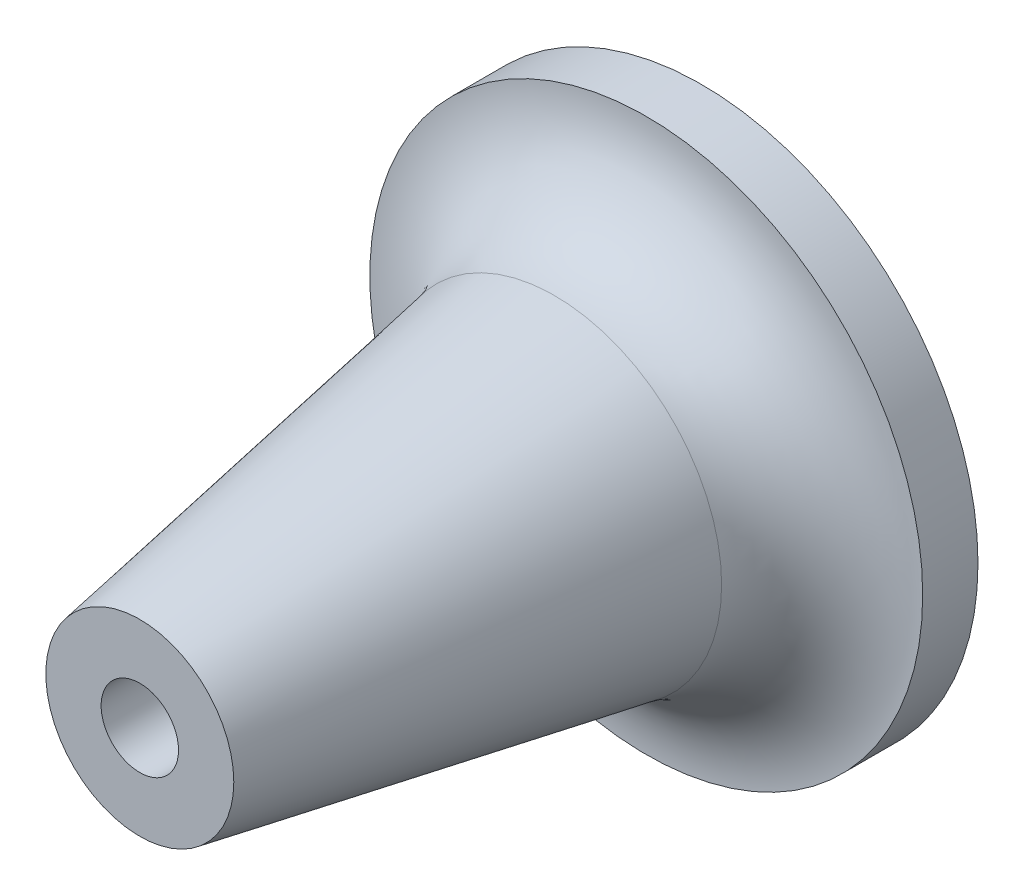
ISO-10303-21;
HEADER;
FILE_DESCRIPTION(('STEP AP214'),'2;1');
FILE_NAME('part.step','',(''),(''),'','','');
FILE_SCHEMA(('AUTOMOTIVE_DESIGN { 1 0 10303 214 1 1 1 1 }'));
ENDSEC;
DATA;
#1=APPLICATION_CONTEXT('core data for automotive mechanical design processes');
#2=APPLICATION_PROTOCOL_DEFINITION('international standard','automotive_design',2000,#1);
#3=PRODUCT_CONTEXT('',#1,'mechanical');
#4=PRODUCT('Part','Part','',(#3));
#5=PRODUCT_RELATED_PRODUCT_CATEGORY('part','',(#4));
#6=PRODUCT_DEFINITION_FORMATION('','',#4);
#7=PRODUCT_DEFINITION_CONTEXT('part definition',#1,'design');
#8=PRODUCT_DEFINITION('design','',#6,#7);
#9=PRODUCT_DEFINITION_SHAPE('','',#8);
#10=(LENGTH_UNIT() NAMED_UNIT(*) SI_UNIT(.MILLI.,.METRE.));
#11=(NAMED_UNIT(*) PLANE_ANGLE_UNIT() SI_UNIT($,.RADIAN.));
#12=(NAMED_UNIT(*) SI_UNIT($,.STERADIAN.) SOLID_ANGLE_UNIT());
#13=UNCERTAINTY_MEASURE_WITH_UNIT(LENGTH_MEASURE(1.E-05),#10,'distance_accuracy_value','');
#14=(GEOMETRIC_REPRESENTATION_CONTEXT(3) GLOBAL_UNCERTAINTY_ASSIGNED_CONTEXT((#13)) GLOBAL_UNIT_ASSIGNED_CONTEXT((#10,
#11,#12)) REPRESENTATION_CONTEXT('',''));
#15=CARTESIAN_POINT('',(0.,0.,0.));
#16=DIRECTION('',(0.,0.,1.));
#17=DIRECTION('',(1.,0.,0.));
#18=AXIS2_PLACEMENT_3D('',#15,#16,#17);
#19=CARTESIAN_POINT('',(0.,8.5,33.7153604632454));
#20=DIRECTION('',(0.,0.,-1.));
#21=DIRECTION('',(-1.,0.,0.));
#22=AXIS2_PLACEMENT_3D('',#19,#20,#21);
#23=PLANE('',#22);
#24=CARTESIAN_POINT('',(0.,0.,33.7153604632454));
#25=DIRECTION('',(0.,0.,1.));
#26=DIRECTION('',(1.,0.,0.));
#27=AXIS2_PLACEMENT_3D('',#24,#25,#26);
#28=CIRCLE('',#27,3.5);
#29=CARTESIAN_POINT('',(3.5,0.,33.7153604632454));
#30=VERTEX_POINT('',#29);
#31=EDGE_CURVE('E10',#30,#30,#28,.T.);
#32=ORIENTED_EDGE('',*,*,#31,.F.);
#33=EDGE_LOOP('',(#32));
#34=FACE_BOUND('',#33,.T.);
#35=CARTESIAN_POINT('',(0.,0.,33.7153604632454));
#36=DIRECTION('',(0.,0.,1.));
#37=DIRECTION('',(1.,0.,0.));
#38=AXIS2_PLACEMENT_3D('',#35,#36,#37);
#39=CIRCLE('',#38,8.5);
#40=CARTESIAN_POINT('',(8.5,0.,33.7153604632454));
#41=VERTEX_POINT('',#40);
#42=EDGE_CURVE('E59',#41,#41,#39,.T.);
#43=ORIENTED_EDGE('',*,*,#42,.T.);
#44=EDGE_LOOP('',(#43));
#45=FACE_BOUND('',#44,.T.);
#46=ADVANCED_FACE('F31',(#34,#45),#23,.F.);
#47=CARTESIAN_POINT('',(0.,0.,51.4954979569622));
#48=DIRECTION('',(0.,0.,1.));
#49=DIRECTION('',(1.,0.,0.));
#50=AXIS2_PLACEMENT_3D('',#47,#48,#49);
#51=CYLINDRICAL_SURFACE('',#50,3.5);
#52=CARTESIAN_POINT('',(0.,0.,-8.08463953675459));
#53=DIRECTION('',(0.,0.,1.));
#54=DIRECTION('',(1.,0.,0.));
#55=AXIS2_PLACEMENT_3D('',#52,#53,#54);
#56=CIRCLE('',#55,3.5);
#57=CARTESIAN_POINT('',(3.5,0.,-8.08463953675459));
#58=VERTEX_POINT('',#57);
#59=EDGE_CURVE('E37',#58,#58,#56,.T.);
#60=ORIENTED_EDGE('',*,*,#59,.F.);
#61=EDGE_LOOP('',(#60));
#62=FACE_BOUND('',#61,.T.);
#63=ORIENTED_EDGE('',*,*,#31,.T.);
#64=EDGE_LOOP('',(#63));
#65=FACE_BOUND('',#64,.T.);
#66=ADVANCED_FACE('F101',(#62,#65),#51,.F.);
#67=CARTESIAN_POINT('',(0.,3.5,-8.08463953675459));
#68=DIRECTION('',(0.,0.,-1.));
#69=DIRECTION('',(-1.,0.,0.));
#70=AXIS2_PLACEMENT_3D('',#67,#68,#69);
#71=PLANE('',#70);
#72=ORIENTED_EDGE('',*,*,#59,.T.);
#73=EDGE_LOOP('',(#72));
#74=FACE_BOUND('',#73,.T.);
#75=ADVANCED_FACE('F96',(#74),#71,.F.);
#76=CARTESIAN_POINT('',(0.,0.,-8.28463953675459));
#77=DIRECTION('',(0.,0.,1.));
#78=DIRECTION('',(1.,0.,0.));
#79=AXIS2_PLACEMENT_3D('',#76,#77,#78);
#80=PLANE('',#79);
#81=CARTESIAN_POINT('',(0.,0.,-8.28463953675458));
#82=DIRECTION('',(0.,0.,1.));
#83=DIRECTION('',(1.,0.,0.));
#84=AXIS2_PLACEMENT_3D('',#81,#82,#83);
#85=CIRCLE('',#84,11.55);
#86=CARTESIAN_POINT('',(11.55,0.,-8.28463953675458));
#87=VERTEX_POINT('',#86);
#88=EDGE_CURVE('E41',#87,#87,#85,.T.);
#89=ORIENTED_EDGE('',*,*,#88,.F.);
#90=EDGE_LOOP('',(#89));
#91=FACE_BOUND('',#90,.T.);
#92=ADVANCED_FACE('F91',(#91),#80,.F.);
#93=CARTESIAN_POINT('',(0.,0.,51.4954979569622));
#94=DIRECTION('',(0.,0.,1.));
#95=DIRECTION('',(1.,0.,0.));
#96=AXIS2_PLACEMENT_3D('',#93,#94,#95);
#97=CYLINDRICAL_SURFACE('',#96,11.55);
#98=CARTESIAN_POINT('',(0.,0.,-17.0846395367546));
#99=DIRECTION('',(0.,0.,1.));
#100=DIRECTION('',(1.,0.,0.));
#101=AXIS2_PLACEMENT_3D('',#98,#99,#100);
#102=CIRCLE('',#101,11.55);
#103=CARTESIAN_POINT('',(11.55,0.,-17.0846395367546));
#104=VERTEX_POINT('',#103);
#105=EDGE_CURVE('E45',#104,#104,#102,.T.);
#106=ORIENTED_EDGE('',*,*,#105,.F.);
#107=EDGE_LOOP('',(#106));
#108=FACE_BOUND('',#107,.T.);
#109=ORIENTED_EDGE('',*,*,#88,.T.);
#110=EDGE_LOOP('',(#109));
#111=FACE_BOUND('',#110,.T.);
#112=ADVANCED_FACE('F85',(#108,#111),#97,.F.);
#113=CARTESIAN_POINT('',(0.,11.55,-17.0846395367546));
#114=DIRECTION('',(0.,0.,1.));
#115=DIRECTION('',(1.,0.,0.));
#116=AXIS2_PLACEMENT_3D('',#113,#114,#115);
#117=PLANE('',#116);
#118=CARTESIAN_POINT('',(0.,0.,-17.0846395367546));
#119=DIRECTION('',(0.,0.,1.));
#120=DIRECTION('',(1.,0.,0.));
#121=AXIS2_PLACEMENT_3D('',#118,#119,#120);
#122=CIRCLE('',#121,25.);
#123=CARTESIAN_POINT('',(25.,0.,-17.0846395367546));
#124=VERTEX_POINT('',#123);
#125=EDGE_CURVE('E50',#124,#124,#122,.T.);
#126=ORIENTED_EDGE('',*,*,#125,.F.);
#127=EDGE_LOOP('',(#126));
#128=FACE_BOUND('',#127,.T.);
#129=ORIENTED_EDGE('',*,*,#105,.T.);
#130=EDGE_LOOP('',(#129));
#131=FACE_BOUND('',#130,.T.);
#132=ADVANCED_FACE('F79',(#128,#131),#117,.F.);
#133=CARTESIAN_POINT('',(0.,0.,51.4954979569622));
#134=DIRECTION('',(0.,0.,1.));
#135=DIRECTION('',(1.,0.,0.));
#136=AXIS2_PLACEMENT_3D('',#133,#134,#135);
#137=CYLINDRICAL_SURFACE('',#136,25.);
#138=CARTESIAN_POINT('',(0.,0.,-12.0846395367546));
#139=DIRECTION('',(0.,0.,1.));
#140=DIRECTION('',(1.,0.,0.));
#141=AXIS2_PLACEMENT_3D('',#138,#139,#140);
#142=CIRCLE('',#141,25.);
#143=CARTESIAN_POINT('',(25.,0.,-12.0846395367546));
#144=VERTEX_POINT('',#143);
#145=EDGE_CURVE('E53',#144,#144,#142,.T.);
#146=ORIENTED_EDGE('',*,*,#145,.F.);
#147=EDGE_LOOP('',(#146));
#148=FACE_BOUND('',#147,.T.);
#149=ORIENTED_EDGE('',*,*,#125,.T.);
#150=EDGE_LOOP('',(#149));
#151=FACE_BOUND('',#150,.T.);
#152=ADVANCED_FACE('F73',(#148,#151),#137,.T.);
#153=CARTESIAN_POINT('',(0.,0.,-2.04503998201178));
#154=DIRECTION('',(0.,0.,1.));
#155=DIRECTION('',(1.,0.,0.));
#156=AXIS2_PLACEMENT_3D('',#153,#154,#155);
#157=TOROIDAL_SURFACE('',#156,25.,10.0395995547428);
#158=CARTESIAN_POINT('',(0.,0.,-3.7883981491986));
#159=DIRECTION('',(0.,0.,1.));
#160=DIRECTION('',(1.,0.,0.));
#161=AXIS2_PLACEMENT_3D('',#158,#159,#160);
#162=CIRCLE('',#161,15.1129245213514);
#163=CARTESIAN_POINT('',(15.1129245213514,0.,-3.7883981491986));
#164=VERTEX_POINT('',#163);
#165=EDGE_CURVE('E56',#164,#164,#162,.T.);
#166=ORIENTED_EDGE('',*,*,#165,.F.);
#167=EDGE_LOOP('',(#166));
#168=FACE_BOUND('',#167,.T.);
#169=ORIENTED_EDGE('',*,*,#145,.T.);
#170=EDGE_LOOP('',(#169));
#171=FACE_BOUND('',#170,.T.);
#172=ADVANCED_FACE('F67',(#168,#171),#157,.F.);
#173=CARTESIAN_POINT('',(0.,0.,-3.7883981491986));
#174=DIRECTION('',(0.,0.,-1.));
#175=DIRECTION('',(-1.,0.,0.));
#176=AXIS2_PLACEMENT_3D('',#173,#174,#175);
#177=CONICAL_SURFACE('',#176,15.1129245213514,0.174532925199434);
#178=ORIENTED_EDGE('',*,*,#42,.F.);
#179=EDGE_LOOP('',(#178));
#180=FACE_BOUND('',#179,.T.);
#181=ORIENTED_EDGE('',*,*,#165,.T.);
#182=EDGE_LOOP('',(#181));
#183=FACE_BOUND('',#182,.T.);
#184=ADVANCED_FACE('F64',(#180,#183),#177,.T.);
#185=CLOSED_SHELL('',(#46,#66,#75,#92,#112,#132,#152,#172,#184));
#186=MANIFOLD_SOLID_BREP('B2',#185);
#187=ADVANCED_BREP_SHAPE_REPRESENTATION('',(#18,#186),#14);
#188=SHAPE_DEFINITION_REPRESENTATION(#9,#187);
ENDSEC;
END-ISO-10303-21;
